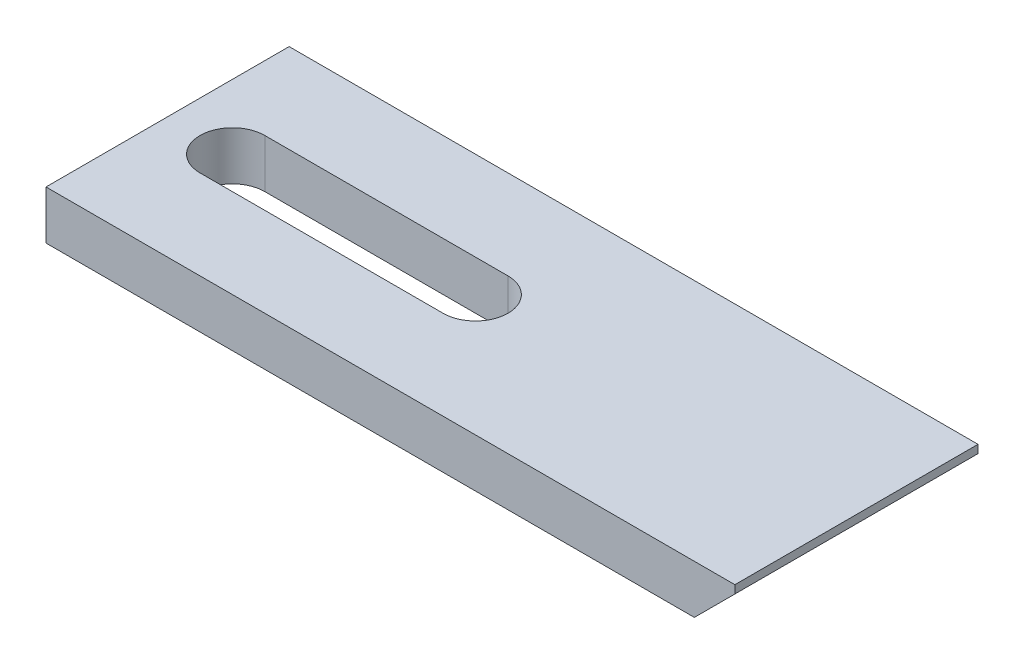
ISO-10303-21;
HEADER;
FILE_DESCRIPTION(('STEP AP214'),'2;1');
FILE_NAME('part.step','',(''),(''),'','','');
FILE_SCHEMA(('AUTOMOTIVE_DESIGN { 1 0 10303 214 1 1 1 1 }'));
ENDSEC;
DATA;
#1=APPLICATION_CONTEXT('core data for automotive mechanical design processes');
#2=APPLICATION_PROTOCOL_DEFINITION('international standard','automotive_design',2000,#1);
#3=PRODUCT_CONTEXT('',#1,'mechanical');
#4=PRODUCT('Part','Part','',(#3));
#5=PRODUCT_RELATED_PRODUCT_CATEGORY('part','',(#4));
#6=PRODUCT_DEFINITION_FORMATION('','',#4);
#7=PRODUCT_DEFINITION_CONTEXT('part definition',#1,'design');
#8=PRODUCT_DEFINITION('design','',#6,#7);
#9=PRODUCT_DEFINITION_SHAPE('','',#8);
#10=(LENGTH_UNIT() NAMED_UNIT(*) SI_UNIT(.MILLI.,.METRE.));
#11=(NAMED_UNIT(*) PLANE_ANGLE_UNIT() SI_UNIT($,.RADIAN.));
#12=(NAMED_UNIT(*) SI_UNIT($,.STERADIAN.) SOLID_ANGLE_UNIT());
#13=UNCERTAINTY_MEASURE_WITH_UNIT(LENGTH_MEASURE(1.E-05),#10,'distance_accuracy_value','');
#14=(GEOMETRIC_REPRESENTATION_CONTEXT(3) GLOBAL_UNCERTAINTY_ASSIGNED_CONTEXT((#13)) GLOBAL_UNIT_ASSIGNED_CONTEXT((#10,
#11,#12)) REPRESENTATION_CONTEXT('',''));
#15=CARTESIAN_POINT('',(0.,0.,0.));
#16=DIRECTION('',(0.,0.,1.));
#17=DIRECTION('',(1.,0.,0.));
#18=AXIS2_PLACEMENT_3D('',#15,#16,#17);
#19=CARTESIAN_POINT('',(-42.5,6.,15.));
#20=DIRECTION('',(0.,1.,0.));
#21=DIRECTION('',(0.,0.,1.));
#22=AXIS2_PLACEMENT_3D('',#19,#20,#21);
#23=PLANE('',#22);
#24=DIRECTION('',(-1.,0.,0.));
#25=VECTOR('',#24,1.);
#26=CARTESIAN_POINT('',(-34.5,6.,-3.99999999999999));
#27=LINE('',#26,#25);
#28=CARTESIAN_POINT('',(-4.50000000000001,6.,-3.99999999999999));
#29=VERTEX_POINT('',#28);
#30=CARTESIAN_POINT('',(-34.5,6.,-3.99999999999999));
#31=VERTEX_POINT('',#30);
#32=EDGE_CURVE('E151',#29,#31,#27,.T.);
#33=ORIENTED_EDGE('',*,*,#32,.F.);
#34=CARTESIAN_POINT('',(-4.5,6.,0.));
#35=DIRECTION('',(0.,1.,0.));
#36=DIRECTION('',(0.,0.,-1.));
#37=AXIS2_PLACEMENT_3D('',#34,#35,#36);
#38=CIRCLE('',#37,4.);
#39=CARTESIAN_POINT('',(-4.50000000000001,6.,4.00000000000001));
#40=VERTEX_POINT('',#39);
#41=EDGE_CURVE('E169',#40,#29,#38,.T.);
#42=ORIENTED_EDGE('',*,*,#41,.F.);
#43=DIRECTION('',(1.,0.,0.));
#44=VECTOR('',#43,1.);
#45=CARTESIAN_POINT('',(-34.5,6.,4.00000000000001));
#46=LINE('',#45,#44);
#47=CARTESIAN_POINT('',(-34.5,6.,4.00000000000001));
#48=VERTEX_POINT('',#47);
#49=EDGE_CURVE('E161',#48,#40,#46,.T.);
#50=ORIENTED_EDGE('',*,*,#49,.F.);
#51=CARTESIAN_POINT('',(-34.5,6.,0.));
#52=DIRECTION('',(0.,1.,0.));
#53=DIRECTION('',(0.,0.,1.));
#54=AXIS2_PLACEMENT_3D('',#51,#52,#53);
#55=CIRCLE('',#54,4.);
#56=EDGE_CURVE('E155',#31,#48,#55,.T.);
#57=ORIENTED_EDGE('',*,*,#56,.F.);
#58=EDGE_LOOP('',(#33,#42,#50,#57));
#59=FACE_BOUND('',#58,.T.);
#60=DIRECTION('',(0.,0.,1.));
#61=VECTOR('',#60,1.);
#62=CARTESIAN_POINT('',(-42.5,6.,-15.));
#63=LINE('',#62,#61);
#64=CARTESIAN_POINT('',(-42.5,6.,-15.));
#65=VERTEX_POINT('',#64);
#66=CARTESIAN_POINT('',(-42.5,6.,15.));
#67=VERTEX_POINT('',#66);
#68=EDGE_CURVE('E131',#65,#67,#63,.T.);
#69=ORIENTED_EDGE('',*,*,#68,.T.);
#70=DIRECTION('',(1.,0.,0.));
#71=VECTOR('',#70,1.);
#72=CARTESIAN_POINT('',(-42.5,6.,15.));
#73=LINE('',#72,#71);
#74=CARTESIAN_POINT('',(42.5,6.,15.));
#75=VERTEX_POINT('',#74);
#76=EDGE_CURVE('E142',#67,#75,#73,.T.);
#77=ORIENTED_EDGE('',*,*,#76,.T.);
#78=DIRECTION('',(0.,0.,-1.));
#79=VECTOR('',#78,1.);
#80=CARTESIAN_POINT('',(42.5,6.,-15.));
#81=LINE('',#80,#79);
#82=CARTESIAN_POINT('',(42.5,6.,-15.));
#83=VERTEX_POINT('',#82);
#84=EDGE_CURVE('E140',#75,#83,#81,.T.);
#85=ORIENTED_EDGE('',*,*,#84,.T.);
#86=DIRECTION('',(-1.,0.,0.));
#87=VECTOR('',#86,1.);
#88=CARTESIAN_POINT('',(-42.5,6.,-15.));
#89=LINE('',#88,#87);
#90=EDGE_CURVE('E123',#83,#65,#89,.T.);
#91=ORIENTED_EDGE('',*,*,#90,.T.);
#92=EDGE_LOOP('',(#69,#77,#85,#91));
#93=FACE_BOUND('',#92,.T.);
#94=ADVANCED_FACE('F33',(#59,#93),#23,.T.);
#95=CARTESIAN_POINT('',(-42.5,0.,15.));
#96=DIRECTION('',(0.,1.,0.));
#97=DIRECTION('',(0.,0.,1.));
#98=AXIS2_PLACEMENT_3D('',#95,#96,#97);
#99=PLANE('',#98);
#100=CARTESIAN_POINT('',(-4.5,0.,0.));
#101=DIRECTION('',(0.,1.,0.));
#102=DIRECTION('',(0.,0.,-1.));
#103=AXIS2_PLACEMENT_3D('',#100,#101,#102);
#104=CIRCLE('',#103,4.);
#105=CARTESIAN_POINT('',(-4.50000000000002,0.,4.00000000000001));
#106=VERTEX_POINT('',#105);
#107=CARTESIAN_POINT('',(-4.50000000000001,0.,-3.99999999999999));
#108=VERTEX_POINT('',#107);
#109=EDGE_CURVE('E170',#106,#108,#104,.T.);
#110=ORIENTED_EDGE('',*,*,#109,.T.);
#111=DIRECTION('',(-1.,0.,0.));
#112=VECTOR('',#111,1.);
#113=CARTESIAN_POINT('',(-34.5,0.,-3.99999999999999));
#114=LINE('',#113,#112);
#115=CARTESIAN_POINT('',(-34.5,0.,-3.99999999999999));
#116=VERTEX_POINT('',#115);
#117=EDGE_CURVE('E152',#108,#116,#114,.T.);
#118=ORIENTED_EDGE('',*,*,#117,.T.);
#119=CARTESIAN_POINT('',(-34.5,0.,0.));
#120=DIRECTION('',(0.,1.,0.));
#121=DIRECTION('',(0.,0.,1.));
#122=AXIS2_PLACEMENT_3D('',#119,#120,#121);
#123=CIRCLE('',#122,4.);
#124=CARTESIAN_POINT('',(-34.5,0.,4.00000000000001));
#125=VERTEX_POINT('',#124);
#126=EDGE_CURVE('E157',#116,#125,#123,.T.);
#127=ORIENTED_EDGE('',*,*,#126,.T.);
#128=DIRECTION('',(1.,0.,0.));
#129=VECTOR('',#128,1.);
#130=CARTESIAN_POINT('',(-34.5,0.,4.00000000000001));
#131=LINE('',#130,#129);
#132=EDGE_CURVE('E56',#125,#106,#131,.T.);
#133=ORIENTED_EDGE('',*,*,#132,.T.);
#134=EDGE_LOOP('',(#110,#118,#127,#133));
#135=FACE_BOUND('',#134,.T.);
#136=DIRECTION('',(-1.,0.,0.));
#137=VECTOR('',#136,1.);
#138=CARTESIAN_POINT('',(-42.5,0.,-15.));
#139=LINE('',#138,#137);
#140=CARTESIAN_POINT('',(37.5,0.,-15.));
#141=VERTEX_POINT('',#140);
#142=CARTESIAN_POINT('',(-42.5,0.,-15.));
#143=VERTEX_POINT('',#142);
#144=EDGE_CURVE('E129',#141,#143,#139,.T.);
#145=ORIENTED_EDGE('',*,*,#144,.F.);
#146=DIRECTION('',(0.,0.,1.));
#147=VECTOR('',#146,1.);
#148=CARTESIAN_POINT('',(37.5,0.,-15.));
#149=LINE('',#148,#147);
#150=CARTESIAN_POINT('',(37.5,0.,15.));
#151=VERTEX_POINT('',#150);
#152=EDGE_CURVE('E48',#141,#151,#149,.T.);
#153=ORIENTED_EDGE('',*,*,#152,.T.);
#154=DIRECTION('',(1.,0.,0.));
#155=VECTOR('',#154,1.);
#156=CARTESIAN_POINT('',(-42.5,0.,15.));
#157=LINE('',#156,#155);
#158=CARTESIAN_POINT('',(-42.5,0.,15.));
#159=VERTEX_POINT('',#158);
#160=EDGE_CURVE('E132',#159,#151,#157,.T.);
#161=ORIENTED_EDGE('',*,*,#160,.F.);
#162=DIRECTION('',(0.,0.,1.));
#163=VECTOR('',#162,1.);
#164=CARTESIAN_POINT('',(-42.5,0.,-15.));
#165=LINE('',#164,#163);
#166=EDGE_CURVE('E135',#143,#159,#165,.T.);
#167=ORIENTED_EDGE('',*,*,#166,.F.);
#168=EDGE_LOOP('',(#145,#153,#161,#167));
#169=FACE_BOUND('',#168,.T.);
#170=ADVANCED_FACE('F177',(#135,#169),#99,.F.);
#171=CARTESIAN_POINT('',(-42.5,6.,-15.));
#172=DIRECTION('',(1.,0.,0.));
#173=DIRECTION('',(0.,0.,-1.));
#174=AXIS2_PLACEMENT_3D('',#171,#172,#173);
#175=PLANE('',#174);
#176=ORIENTED_EDGE('',*,*,#166,.T.);
#177=DIRECTION('',(0.,-1.,0.));
#178=VECTOR('',#177,1.);
#179=CARTESIAN_POINT('',(-42.5,6.,15.));
#180=LINE('',#179,#178);
#181=EDGE_CURVE('E11',#67,#159,#180,.T.);
#182=ORIENTED_EDGE('',*,*,#181,.F.);
#183=ORIENTED_EDGE('',*,*,#68,.F.);
#184=DIRECTION('',(0.,-1.,0.));
#185=VECTOR('',#184,1.);
#186=CARTESIAN_POINT('',(-42.5,6.,-15.));
#187=LINE('',#186,#185);
#188=EDGE_CURVE('E124',#65,#143,#187,.T.);
#189=ORIENTED_EDGE('',*,*,#188,.T.);
#190=EDGE_LOOP('',(#176,#182,#183,#189));
#191=FACE_BOUND('',#190,.T.);
#192=ADVANCED_FACE('F35',(#191),#175,.F.);
#193=CARTESIAN_POINT('',(-42.5,6.,15.));
#194=DIRECTION('',(0.,0.,-1.));
#195=DIRECTION('',(-1.,0.,0.));
#196=AXIS2_PLACEMENT_3D('',#193,#194,#195);
#197=PLANE('',#196);
#198=ORIENTED_EDGE('',*,*,#160,.T.);
#199=DIRECTION('',(-0.707106781186547,-0.707106781186548,0.));
#200=VECTOR('',#199,1.);
#201=CARTESIAN_POINT('',(42.5,5.,15.));
#202=LINE('',#201,#200);
#203=CARTESIAN_POINT('',(42.5,5.,15.));
#204=VERTEX_POINT('',#203);
#205=EDGE_CURVE('E110',#204,#151,#202,.T.);
#206=ORIENTED_EDGE('',*,*,#205,.F.);
#207=DIRECTION('',(0.,-1.,0.));
#208=VECTOR('',#207,1.);
#209=CARTESIAN_POINT('',(42.5,6.,15.));
#210=LINE('',#209,#208);
#211=EDGE_CURVE('E41',#75,#204,#210,.T.);
#212=ORIENTED_EDGE('',*,*,#211,.F.);
#213=ORIENTED_EDGE('',*,*,#76,.F.);
#214=ORIENTED_EDGE('',*,*,#181,.T.);
#215=EDGE_LOOP('',(#198,#206,#212,#213,#214));
#216=FACE_BOUND('',#215,.T.);
#217=ADVANCED_FACE('F179',(#216),#197,.F.);
#218=CARTESIAN_POINT('',(42.5,6.,-15.));
#219=DIRECTION('',(-1.,0.,0.));
#220=DIRECTION('',(0.,0.,1.));
#221=AXIS2_PLACEMENT_3D('',#218,#219,#220);
#222=PLANE('',#221);
#223=ORIENTED_EDGE('',*,*,#211,.T.);
#224=DIRECTION('',(0.,0.,1.));
#225=VECTOR('',#224,1.);
#226=CARTESIAN_POINT('',(42.5,5.,-15.));
#227=LINE('',#226,#225);
#228=CARTESIAN_POINT('',(42.5,5.,-15.));
#229=VERTEX_POINT('',#228);
#230=EDGE_CURVE('E105',#229,#204,#227,.T.);
#231=ORIENTED_EDGE('',*,*,#230,.F.);
#232=DIRECTION('',(0.,-1.,0.));
#233=VECTOR('',#232,1.);
#234=CARTESIAN_POINT('',(42.5,6.,-15.));
#235=LINE('',#234,#233);
#236=EDGE_CURVE('E117',#83,#229,#235,.T.);
#237=ORIENTED_EDGE('',*,*,#236,.F.);
#238=ORIENTED_EDGE('',*,*,#84,.F.);
#239=EDGE_LOOP('',(#223,#231,#237,#238));
#240=FACE_BOUND('',#239,.T.);
#241=ADVANCED_FACE('F115',(#240),#222,.F.);
#242=CARTESIAN_POINT('',(-42.5,6.,-15.));
#243=DIRECTION('',(0.,0.,1.));
#244=DIRECTION('',(1.,0.,0.));
#245=AXIS2_PLACEMENT_3D('',#242,#243,#244);
#246=PLANE('',#245);
#247=ORIENTED_EDGE('',*,*,#236,.T.);
#248=DIRECTION('',(-0.707106781186547,-0.707106781186548,0.));
#249=VECTOR('',#248,1.);
#250=CARTESIAN_POINT('',(42.5,5.,-15.));
#251=LINE('',#250,#249);
#252=EDGE_CURVE('E102',#229,#141,#251,.T.);
#253=ORIENTED_EDGE('',*,*,#252,.T.);
#254=ORIENTED_EDGE('',*,*,#144,.T.);
#255=ORIENTED_EDGE('',*,*,#188,.F.);
#256=ORIENTED_EDGE('',*,*,#90,.F.);
#257=EDGE_LOOP('',(#247,#253,#254,#255,#256));
#258=FACE_BOUND('',#257,.T.);
#259=ADVANCED_FACE('F121',(#258),#246,.F.);
#260=CARTESIAN_POINT('',(-34.5,6.,0.));
#261=DIRECTION('',(0.,-1.,0.));
#262=DIRECTION('',(0.,0.,-1.));
#263=AXIS2_PLACEMENT_3D('',#260,#261,#262);
#264=CYLINDRICAL_SURFACE('',#263,4.);
#265=ORIENTED_EDGE('',*,*,#126,.F.);
#266=DIRECTION('',(0.,-1.,0.));
#267=VECTOR('',#266,1.);
#268=CARTESIAN_POINT('',(-34.5,6.,-3.99999999999999));
#269=LINE('',#268,#267);
#270=EDGE_CURVE('E148',#31,#116,#269,.T.);
#271=ORIENTED_EDGE('',*,*,#270,.F.);
#272=ORIENTED_EDGE('',*,*,#56,.T.);
#273=DIRECTION('',(0.,-1.,0.));
#274=VECTOR('',#273,1.);
#275=CARTESIAN_POINT('',(-34.5,6.,4.00000000000001));
#276=LINE('',#275,#274);
#277=EDGE_CURVE('E138',#48,#125,#276,.T.);
#278=ORIENTED_EDGE('',*,*,#277,.T.);
#279=EDGE_LOOP('',(#265,#271,#272,#278));
#280=FACE_BOUND('',#279,.T.);
#281=ADVANCED_FACE('F192',(#280),#264,.F.);
#282=CARTESIAN_POINT('',(-34.5,6.,4.00000000000001));
#283=DIRECTION('',(0.,0.,-1.));
#284=DIRECTION('',(-1.,0.,0.));
#285=AXIS2_PLACEMENT_3D('',#282,#283,#284);
#286=PLANE('',#285);
#287=ORIENTED_EDGE('',*,*,#132,.F.);
#288=ORIENTED_EDGE('',*,*,#277,.F.);
#289=ORIENTED_EDGE('',*,*,#49,.T.);
#290=DIRECTION('',(0.,-1.,0.));
#291=VECTOR('',#290,1.);
#292=CARTESIAN_POINT('',(-4.50000000000001,6.,4.00000000000001));
#293=LINE('',#292,#291);
#294=EDGE_CURVE('E166',#40,#106,#293,.T.);
#295=ORIENTED_EDGE('',*,*,#294,.T.);
#296=EDGE_LOOP('',(#287,#288,#289,#295));
#297=FACE_BOUND('',#296,.T.);
#298=ADVANCED_FACE('F217',(#297),#286,.T.);
#299=CARTESIAN_POINT('',(-34.5,6.,-3.99999999999999));
#300=DIRECTION('',(0.,0.,1.));
#301=DIRECTION('',(1.,0.,0.));
#302=AXIS2_PLACEMENT_3D('',#299,#300,#301);
#303=PLANE('',#302);
#304=ORIENTED_EDGE('',*,*,#117,.F.);
#305=DIRECTION('',(0.,-1.,0.));
#306=VECTOR('',#305,1.);
#307=CARTESIAN_POINT('',(-4.50000000000001,6.,-3.99999999999999));
#308=LINE('',#307,#306);
#309=EDGE_CURVE('E159',#29,#108,#308,.T.);
#310=ORIENTED_EDGE('',*,*,#309,.F.);
#311=ORIENTED_EDGE('',*,*,#32,.T.);
#312=ORIENTED_EDGE('',*,*,#270,.T.);
#313=EDGE_LOOP('',(#304,#310,#311,#312));
#314=FACE_BOUND('',#313,.T.);
#315=ADVANCED_FACE('F222',(#314),#303,.T.);
#316=CARTESIAN_POINT('',(-4.5,6.,0.));
#317=DIRECTION('',(0.,-1.,0.));
#318=DIRECTION('',(0.,0.,-1.));
#319=AXIS2_PLACEMENT_3D('',#316,#317,#318);
#320=CYLINDRICAL_SURFACE('',#319,4.);
#321=ORIENTED_EDGE('',*,*,#109,.F.);
#322=ORIENTED_EDGE('',*,*,#294,.F.);
#323=ORIENTED_EDGE('',*,*,#41,.T.);
#324=ORIENTED_EDGE('',*,*,#309,.T.);
#325=EDGE_LOOP('',(#321,#322,#323,#324));
#326=FACE_BOUND('',#325,.T.);
#327=ADVANCED_FACE('F232',(#326),#320,.F.);
#328=CARTESIAN_POINT('',(42.5,5.,-15.));
#329=DIRECTION('',(-0.707106781186548,0.707106781186547,0.));
#330=DIRECTION('',(-0.707106781186547,-0.707106781186548,0.));
#331=AXIS2_PLACEMENT_3D('',#328,#329,#330);
#332=PLANE('',#331);
#333=ORIENTED_EDGE('',*,*,#205,.T.);
#334=ORIENTED_EDGE('',*,*,#152,.F.);
#335=ORIENTED_EDGE('',*,*,#252,.F.);
#336=ORIENTED_EDGE('',*,*,#230,.T.);
#337=EDGE_LOOP('',(#333,#334,#335,#336));
#338=FACE_BOUND('',#337,.T.);
#339=ADVANCED_FACE('F104',(#338),#332,.F.);
#340=CLOSED_SHELL('',(#94,#170,#192,#217,#241,#259,#281,#298,#315,#327,#339));
#341=MANIFOLD_SOLID_BREP('B2',#340);
#342=ADVANCED_BREP_SHAPE_REPRESENTATION('',(#18,#341),#14);
#343=SHAPE_DEFINITION_REPRESENTATION(#9,#342);
ENDSEC;
END-ISO-10303-21;
